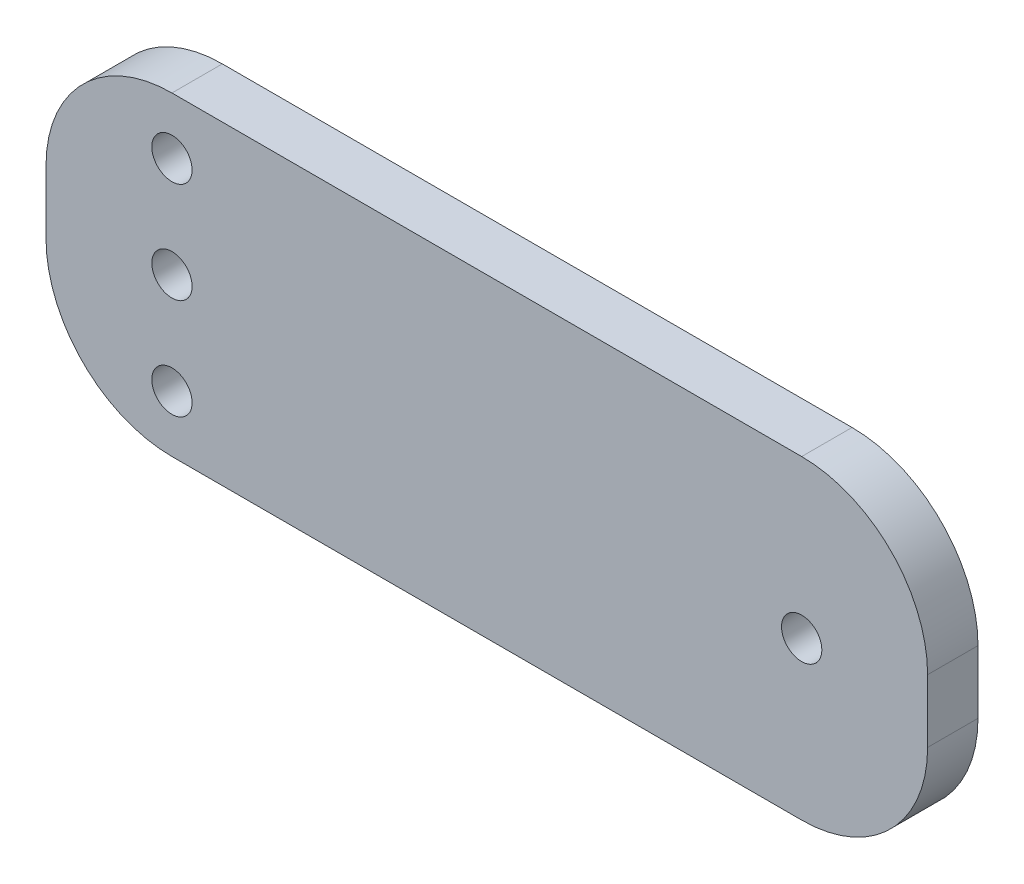
ISO-10303-21;
HEADER;
FILE_DESCRIPTION(('STEP AP214'),'2;1');
FILE_NAME('part.step','',(''),(''),'','','');
FILE_SCHEMA(('AUTOMOTIVE_DESIGN { 1 0 10303 214 1 1 1 1 }'));
ENDSEC;
DATA;
#1=APPLICATION_CONTEXT('core data for automotive mechanical design processes');
#2=APPLICATION_PROTOCOL_DEFINITION('international standard','automotive_design',2000,#1);
#3=PRODUCT_CONTEXT('',#1,'mechanical');
#4=PRODUCT('Part','Part','',(#3));
#5=PRODUCT_RELATED_PRODUCT_CATEGORY('part','',(#4));
#6=PRODUCT_DEFINITION_FORMATION('','',#4);
#7=PRODUCT_DEFINITION_CONTEXT('part definition',#1,'design');
#8=PRODUCT_DEFINITION('design','',#6,#7);
#9=PRODUCT_DEFINITION_SHAPE('','',#8);
#10=(LENGTH_UNIT() NAMED_UNIT(*) SI_UNIT(.MILLI.,.METRE.));
#11=(NAMED_UNIT(*) PLANE_ANGLE_UNIT() SI_UNIT($,.RADIAN.));
#12=(NAMED_UNIT(*) SI_UNIT($,.STERADIAN.) SOLID_ANGLE_UNIT());
#13=UNCERTAINTY_MEASURE_WITH_UNIT(LENGTH_MEASURE(1.E-05),#10,'distance_accuracy_value','');
#14=(GEOMETRIC_REPRESENTATION_CONTEXT(3) GLOBAL_UNCERTAINTY_ASSIGNED_CONTEXT((#13)) GLOBAL_UNIT_ASSIGNED_CONTEXT((#10,
#11,#12)) REPRESENTATION_CONTEXT('',''));
#15=CARTESIAN_POINT('',(0.,0.,0.));
#16=DIRECTION('',(0.,0.,1.));
#17=DIRECTION('',(1.,0.,0.));
#18=AXIS2_PLACEMENT_3D('',#15,#16,#17);
#19=CARTESIAN_POINT('',(0.,0.,4.));
#20=DIRECTION('',(0.,0.,-1.));
#21=DIRECTION('',(-1.,0.,0.));
#22=AXIS2_PLACEMENT_3D('',#19,#20,#21);
#23=PLANE('',#22);
#24=CARTESIAN_POINT('',(-25.,8.,4.));
#25=DIRECTION('',(0.,0.,1.));
#26=DIRECTION('',(1.,0.,0.));
#27=AXIS2_PLACEMENT_3D('',#24,#25,#26);
#28=CIRCLE('',#27,1.6);
#29=CARTESIAN_POINT('',(-23.4,8.,4.));
#30=VERTEX_POINT('',#29);
#31=EDGE_CURVE('E189',#30,#30,#28,.T.);
#32=ORIENTED_EDGE('',*,*,#31,.F.);
#33=EDGE_LOOP('',(#32));
#34=FACE_BOUND('',#33,.T.);
#35=CARTESIAN_POINT('',(-25.,0.,4.));
#36=DIRECTION('',(0.,0.,1.));
#37=DIRECTION('',(1.,0.,0.));
#38=AXIS2_PLACEMENT_3D('',#35,#36,#37);
#39=CIRCLE('',#38,1.6);
#40=CARTESIAN_POINT('',(-23.4,0.,4.));
#41=VERTEX_POINT('',#40);
#42=EDGE_CURVE('E175',#41,#41,#39,.T.);
#43=ORIENTED_EDGE('',*,*,#42,.F.);
#44=EDGE_LOOP('',(#43));
#45=FACE_BOUND('',#44,.T.);
#46=DIRECTION('',(-1.,0.,0.));
#47=VECTOR('',#46,1.);
#48=CARTESIAN_POINT('',(-35.,12.5,4.));
#49=LINE('',#48,#47);
#50=CARTESIAN_POINT('',(25.,12.5,4.));
#51=VERTEX_POINT('',#50);
#52=CARTESIAN_POINT('',(-25.,12.5,4.));
#53=VERTEX_POINT('',#52);
#54=EDGE_CURVE('E170',#51,#53,#49,.T.);
#55=ORIENTED_EDGE('',*,*,#54,.T.);
#56=CARTESIAN_POINT('',(-25.,2.49999999999999,4.));
#57=DIRECTION('',(0.,0.,-1.));
#58=DIRECTION('',(-1.,0.,0.));
#59=AXIS2_PLACEMENT_3D('',#56,#57,#58);
#60=CIRCLE('',#59,10.);
#61=CARTESIAN_POINT('',(-35.,2.49999999999999,4.));
#62=VERTEX_POINT('',#61);
#63=EDGE_CURVE('E151',#53,#62,#60,.F.);
#64=ORIENTED_EDGE('',*,*,#63,.T.);
#65=DIRECTION('',(0.,-1.,0.));
#66=VECTOR('',#65,1.);
#67=CARTESIAN_POINT('',(-35.,-12.5,4.));
#68=LINE('',#67,#66);
#69=CARTESIAN_POINT('',(-35.,-2.49999999999998,4.));
#70=VERTEX_POINT('',#69);
#71=EDGE_CURVE('E121',#62,#70,#68,.T.);
#72=ORIENTED_EDGE('',*,*,#71,.T.);
#73=CARTESIAN_POINT('',(-25.,-2.49999999999999,4.));
#74=DIRECTION('',(0.,0.,-1.));
#75=DIRECTION('',(-1.,0.,0.));
#76=AXIS2_PLACEMENT_3D('',#73,#74,#75);
#77=CIRCLE('',#76,10.);
#78=CARTESIAN_POINT('',(-25.,-12.5,4.));
#79=VERTEX_POINT('',#78);
#80=EDGE_CURVE('E57',#70,#79,#77,.F.);
#81=ORIENTED_EDGE('',*,*,#80,.T.);
#82=DIRECTION('',(1.,0.,0.));
#83=VECTOR('',#82,1.);
#84=CARTESIAN_POINT('',(-35.,-12.5,4.));
#85=LINE('',#84,#83);
#86=CARTESIAN_POINT('',(25.,-12.5,4.));
#87=VERTEX_POINT('',#86);
#88=EDGE_CURVE('E137',#79,#87,#85,.T.);
#89=ORIENTED_EDGE('',*,*,#88,.T.);
#90=CARTESIAN_POINT('',(25.,-2.5,4.));
#91=DIRECTION('',(0.,0.,-1.));
#92=DIRECTION('',(-1.,0.,0.));
#93=AXIS2_PLACEMENT_3D('',#90,#91,#92);
#94=CIRCLE('',#93,10.);
#95=CARTESIAN_POINT('',(35.,-2.5,4.));
#96=VERTEX_POINT('',#95);
#97=EDGE_CURVE('E148',#87,#96,#94,.F.);
#98=ORIENTED_EDGE('',*,*,#97,.T.);
#99=DIRECTION('',(0.,1.,0.));
#100=VECTOR('',#99,1.);
#101=CARTESIAN_POINT('',(35.,-12.5,4.));
#102=LINE('',#101,#100);
#103=CARTESIAN_POINT('',(35.,2.5,4.));
#104=VERTEX_POINT('',#103);
#105=EDGE_CURVE('E131',#96,#104,#102,.T.);
#106=ORIENTED_EDGE('',*,*,#105,.T.);
#107=CARTESIAN_POINT('',(25.,2.5,4.));
#108=DIRECTION('',(0.,0.,-1.));
#109=DIRECTION('',(-1.,0.,0.));
#110=AXIS2_PLACEMENT_3D('',#107,#108,#109);
#111=CIRCLE('',#110,10.);
#112=EDGE_CURVE('E146',#104,#51,#111,.F.);
#113=ORIENTED_EDGE('',*,*,#112,.T.);
#114=EDGE_LOOP('',(#55,#64,#72,#81,#89,#98,#106,#113));
#115=FACE_BOUND('',#114,.T.);
#116=CARTESIAN_POINT('',(25.,0.,4.));
#117=DIRECTION('',(0.,0.,1.));
#118=DIRECTION('',(1.,0.,0.));
#119=AXIS2_PLACEMENT_3D('',#116,#117,#118);
#120=CIRCLE('',#119,1.6);
#121=CARTESIAN_POINT('',(26.6,0.,4.));
#122=VERTEX_POINT('',#121);
#123=EDGE_CURVE('E184',#122,#122,#120,.T.);
#124=ORIENTED_EDGE('',*,*,#123,.F.);
#125=EDGE_LOOP('',(#124));
#126=FACE_BOUND('',#125,.T.);
#127=CARTESIAN_POINT('',(-25.,-8.,4.));
#128=DIRECTION('',(0.,0.,1.));
#129=DIRECTION('',(1.,0.,0.));
#130=AXIS2_PLACEMENT_3D('',#127,#128,#129);
#131=CIRCLE('',#130,1.6);
#132=CARTESIAN_POINT('',(-23.4,-8.,4.));
#133=VERTEX_POINT('',#132);
#134=EDGE_CURVE('E195',#133,#133,#131,.T.);
#135=ORIENTED_EDGE('',*,*,#134,.F.);
#136=EDGE_LOOP('',(#135));
#137=FACE_BOUND('',#136,.T.);
#138=ADVANCED_FACE('F35',(#34,#45,#115,#126,#137),#23,.F.);
#139=CARTESIAN_POINT('',(0.,0.,0.));
#140=DIRECTION('',(0.,0.,-1.));
#141=DIRECTION('',(-1.,0.,0.));
#142=AXIS2_PLACEMENT_3D('',#139,#140,#141);
#143=PLANE('',#142);
#144=CARTESIAN_POINT('',(-25.,8.,0.));
#145=DIRECTION('',(0.,0.,1.));
#146=DIRECTION('',(1.,0.,0.));
#147=AXIS2_PLACEMENT_3D('',#144,#145,#146);
#148=CIRCLE('',#147,1.6);
#149=CARTESIAN_POINT('',(-23.4,8.,0.));
#150=VERTEX_POINT('',#149);
#151=EDGE_CURVE('E192',#150,#150,#148,.T.);
#152=ORIENTED_EDGE('',*,*,#151,.T.);
#153=EDGE_LOOP('',(#152));
#154=FACE_BOUND('',#153,.T.);
#155=CARTESIAN_POINT('',(-25.,0.,0.));
#156=DIRECTION('',(0.,0.,1.));
#157=DIRECTION('',(1.,0.,0.));
#158=AXIS2_PLACEMENT_3D('',#155,#156,#157);
#159=CIRCLE('',#158,1.6);
#160=CARTESIAN_POINT('',(-23.4,0.,0.));
#161=VERTEX_POINT('',#160);
#162=EDGE_CURVE('E177',#161,#161,#159,.T.);
#163=ORIENTED_EDGE('',*,*,#162,.T.);
#164=EDGE_LOOP('',(#163));
#165=FACE_BOUND('',#164,.T.);
#166=DIRECTION('',(0.,-1.,0.));
#167=VECTOR('',#166,1.);
#168=CARTESIAN_POINT('',(-35.,-12.5,0.));
#169=LINE('',#168,#167);
#170=CARTESIAN_POINT('',(-35.,2.49999999999999,0.));
#171=VERTEX_POINT('',#170);
#172=CARTESIAN_POINT('',(-35.,-2.49999999999998,0.));
#173=VERTEX_POINT('',#172);
#174=EDGE_CURVE('E119',#171,#173,#169,.T.);
#175=ORIENTED_EDGE('',*,*,#174,.F.);
#176=CARTESIAN_POINT('',(-25.,2.49999999999999,0.));
#177=DIRECTION('',(0.,0.,-1.));
#178=DIRECTION('',(-1.,0.,0.));
#179=AXIS2_PLACEMENT_3D('',#176,#177,#178);
#180=CIRCLE('',#179,10.);
#181=CARTESIAN_POINT('',(-25.,12.5,0.));
#182=VERTEX_POINT('',#181);
#183=EDGE_CURVE('E102',#171,#182,#180,.T.);
#184=ORIENTED_EDGE('',*,*,#183,.T.);
#185=DIRECTION('',(-1.,0.,0.));
#186=VECTOR('',#185,1.);
#187=CARTESIAN_POINT('',(-35.,12.5,0.));
#188=LINE('',#187,#186);
#189=CARTESIAN_POINT('',(25.,12.5,0.));
#190=VERTEX_POINT('',#189);
#191=EDGE_CURVE('E129',#190,#182,#188,.T.);
#192=ORIENTED_EDGE('',*,*,#191,.F.);
#193=CARTESIAN_POINT('',(25.,2.5,0.));
#194=DIRECTION('',(0.,0.,-1.));
#195=DIRECTION('',(-1.,0.,0.));
#196=AXIS2_PLACEMENT_3D('',#193,#194,#195);
#197=CIRCLE('',#196,10.);
#198=CARTESIAN_POINT('',(35.,2.5,0.));
#199=VERTEX_POINT('',#198);
#200=EDGE_CURVE('E122',#190,#199,#197,.T.);
#201=ORIENTED_EDGE('',*,*,#200,.T.);
#202=DIRECTION('',(0.,1.,0.));
#203=VECTOR('',#202,1.);
#204=CARTESIAN_POINT('',(35.,-12.5,0.));
#205=LINE('',#204,#203);
#206=CARTESIAN_POINT('',(35.,-2.5,0.));
#207=VERTEX_POINT('',#206);
#208=EDGE_CURVE('E133',#207,#199,#205,.T.);
#209=ORIENTED_EDGE('',*,*,#208,.F.);
#210=CARTESIAN_POINT('',(25.,-2.5,0.));
#211=DIRECTION('',(0.,0.,-1.));
#212=DIRECTION('',(-1.,0.,0.));
#213=AXIS2_PLACEMENT_3D('',#210,#211,#212);
#214=CIRCLE('',#213,10.);
#215=CARTESIAN_POINT('',(25.,-12.5,0.));
#216=VERTEX_POINT('',#215);
#217=EDGE_CURVE('E140',#207,#216,#214,.T.);
#218=ORIENTED_EDGE('',*,*,#217,.T.);
#219=DIRECTION('',(1.,0.,0.));
#220=VECTOR('',#219,1.);
#221=CARTESIAN_POINT('',(-35.,-12.5,0.));
#222=LINE('',#221,#220);
#223=CARTESIAN_POINT('',(-25.,-12.5,0.));
#224=VERTEX_POINT('',#223);
#225=EDGE_CURVE('E128',#224,#216,#222,.T.);
#226=ORIENTED_EDGE('',*,*,#225,.F.);
#227=CARTESIAN_POINT('',(-25.,-2.49999999999999,0.));
#228=DIRECTION('',(0.,0.,-1.));
#229=DIRECTION('',(-1.,0.,0.));
#230=AXIS2_PLACEMENT_3D('',#227,#228,#229);
#231=CIRCLE('',#230,10.);
#232=EDGE_CURVE('E113',#224,#173,#231,.T.);
#233=ORIENTED_EDGE('',*,*,#232,.T.);
#234=EDGE_LOOP('',(#175,#184,#192,#201,#209,#218,#226,#233));
#235=FACE_BOUND('',#234,.T.);
#236=CARTESIAN_POINT('',(25.,0.,0.));
#237=DIRECTION('',(0.,0.,1.));
#238=DIRECTION('',(1.,0.,0.));
#239=AXIS2_PLACEMENT_3D('',#236,#237,#238);
#240=CIRCLE('',#239,1.6);
#241=CARTESIAN_POINT('',(26.6,0.,0.));
#242=VERTEX_POINT('',#241);
#243=EDGE_CURVE('E186',#242,#242,#240,.T.);
#244=ORIENTED_EDGE('',*,*,#243,.T.);
#245=EDGE_LOOP('',(#244));
#246=FACE_BOUND('',#245,.T.);
#247=CARTESIAN_POINT('',(-25.,-8.,0.));
#248=DIRECTION('',(0.,0.,1.));
#249=DIRECTION('',(1.,0.,0.));
#250=AXIS2_PLACEMENT_3D('',#247,#248,#249);
#251=CIRCLE('',#250,1.6);
#252=CARTESIAN_POINT('',(-23.4,-8.,0.));
#253=VERTEX_POINT('',#252);
#254=EDGE_CURVE('E198',#253,#253,#251,.T.);
#255=ORIENTED_EDGE('',*,*,#254,.T.);
#256=EDGE_LOOP('',(#255));
#257=FACE_BOUND('',#256,.T.);
#258=ADVANCED_FACE('F125',(#154,#165,#235,#246,#257),#143,.T.);
#259=CARTESIAN_POINT('',(35.,-12.5,4.));
#260=DIRECTION('',(-1.,0.,0.));
#261=DIRECTION('',(0.,0.,1.));
#262=AXIS2_PLACEMENT_3D('',#259,#260,#261);
#263=PLANE('',#262);
#264=ORIENTED_EDGE('',*,*,#105,.F.);
#265=DIRECTION('',(0.,0.,-1.));
#266=VECTOR('',#265,1.);
#267=CARTESIAN_POINT('',(35.,-2.5,4.));
#268=LINE('',#267,#266);
#269=EDGE_CURVE('E11',#96,#207,#268,.T.);
#270=ORIENTED_EDGE('',*,*,#269,.T.);
#271=ORIENTED_EDGE('',*,*,#208,.T.);
#272=DIRECTION('',(0.,0.,-1.));
#273=VECTOR('',#272,1.);
#274=CARTESIAN_POINT('',(35.,2.5,4.));
#275=LINE('',#274,#273);
#276=EDGE_CURVE('E43',#199,#104,#275,.F.);
#277=ORIENTED_EDGE('',*,*,#276,.T.);
#278=EDGE_LOOP('',(#264,#270,#271,#277));
#279=FACE_BOUND('',#278,.T.);
#280=ADVANCED_FACE('F161',(#279),#263,.F.);
#281=CARTESIAN_POINT('',(-35.,12.5,4.));
#282=DIRECTION('',(0.,-1.,0.));
#283=DIRECTION('',(1.,0.,0.));
#284=AXIS2_PLACEMENT_3D('',#281,#282,#283);
#285=PLANE('',#284);
#286=ORIENTED_EDGE('',*,*,#191,.T.);
#287=DIRECTION('',(0.,0.,-1.));
#288=VECTOR('',#287,1.);
#289=CARTESIAN_POINT('',(-25.,12.5,4.));
#290=LINE('',#289,#288);
#291=EDGE_CURVE('E107',#182,#53,#290,.F.);
#292=ORIENTED_EDGE('',*,*,#291,.T.);
#293=ORIENTED_EDGE('',*,*,#54,.F.);
#294=DIRECTION('',(0.,0.,-1.));
#295=VECTOR('',#294,1.);
#296=CARTESIAN_POINT('',(25.,12.5,4.));
#297=LINE('',#296,#295);
#298=EDGE_CURVE('E112',#51,#190,#297,.T.);
#299=ORIENTED_EDGE('',*,*,#298,.T.);
#300=EDGE_LOOP('',(#286,#292,#293,#299));
#301=FACE_BOUND('',#300,.T.);
#302=ADVANCED_FACE('F174',(#301),#285,.F.);
#303=CARTESIAN_POINT('',(-35.,-12.5,4.));
#304=DIRECTION('',(1.,0.,0.));
#305=DIRECTION('',(0.,0.,-1.));
#306=AXIS2_PLACEMENT_3D('',#303,#304,#305);
#307=PLANE('',#306);
#308=ORIENTED_EDGE('',*,*,#71,.F.);
#309=DIRECTION('',(0.,0.,-1.));
#310=VECTOR('',#309,1.);
#311=CARTESIAN_POINT('',(-35.,2.49999999999999,4.));
#312=LINE('',#311,#310);
#313=EDGE_CURVE('E106',#62,#171,#312,.T.);
#314=ORIENTED_EDGE('',*,*,#313,.T.);
#315=ORIENTED_EDGE('',*,*,#174,.T.);
#316=DIRECTION('',(0.,0.,-1.));
#317=VECTOR('',#316,1.);
#318=CARTESIAN_POINT('',(-35.,-2.49999999999998,4.));
#319=LINE('',#318,#317);
#320=EDGE_CURVE('E123',#173,#70,#319,.F.);
#321=ORIENTED_EDGE('',*,*,#320,.T.);
#322=EDGE_LOOP('',(#308,#314,#315,#321));
#323=FACE_BOUND('',#322,.T.);
#324=ADVANCED_FACE('F118',(#323),#307,.F.);
#325=CARTESIAN_POINT('',(-35.,-12.5,4.));
#326=DIRECTION('',(0.,1.,0.));
#327=DIRECTION('',(-1.,0.,0.));
#328=AXIS2_PLACEMENT_3D('',#325,#326,#327);
#329=PLANE('',#328);
#330=ORIENTED_EDGE('',*,*,#88,.F.);
#331=DIRECTION('',(0.,0.,-1.));
#332=VECTOR('',#331,1.);
#333=CARTESIAN_POINT('',(-25.,-12.5,4.));
#334=LINE('',#333,#332);
#335=EDGE_CURVE('E154',#79,#224,#334,.T.);
#336=ORIENTED_EDGE('',*,*,#335,.T.);
#337=ORIENTED_EDGE('',*,*,#225,.T.);
#338=DIRECTION('',(0.,0.,-1.));
#339=VECTOR('',#338,1.);
#340=CARTESIAN_POINT('',(25.,-12.5,4.));
#341=LINE('',#340,#339);
#342=EDGE_CURVE('E50',#216,#87,#341,.F.);
#343=ORIENTED_EDGE('',*,*,#342,.T.);
#344=EDGE_LOOP('',(#330,#336,#337,#343));
#345=FACE_BOUND('',#344,.T.);
#346=ADVANCED_FACE('F221',(#345),#329,.F.);
#347=CARTESIAN_POINT('',(-25.,0.,4.));
#348=DIRECTION('',(0.,0.,-1.));
#349=DIRECTION('',(-1.,0.,0.));
#350=AXIS2_PLACEMENT_3D('',#347,#348,#349);
#351=CYLINDRICAL_SURFACE('',#350,1.6);
#352=ORIENTED_EDGE('',*,*,#42,.T.);
#353=EDGE_LOOP('',(#352));
#354=FACE_BOUND('',#353,.T.);
#355=ORIENTED_EDGE('',*,*,#162,.F.);
#356=EDGE_LOOP('',(#355));
#357=FACE_BOUND('',#356,.T.);
#358=ADVANCED_FACE('F218',(#354,#357),#351,.F.);
#359=CARTESIAN_POINT('',(25.,0.,4.));
#360=DIRECTION('',(0.,0.,-1.));
#361=DIRECTION('',(-1.,0.,0.));
#362=AXIS2_PLACEMENT_3D('',#359,#360,#361);
#363=CYLINDRICAL_SURFACE('',#362,1.6);
#364=ORIENTED_EDGE('',*,*,#123,.T.);
#365=EDGE_LOOP('',(#364));
#366=FACE_BOUND('',#365,.T.);
#367=ORIENTED_EDGE('',*,*,#243,.F.);
#368=EDGE_LOOP('',(#367));
#369=FACE_BOUND('',#368,.T.);
#370=ADVANCED_FACE('F313',(#366,#369),#363,.F.);
#371=CARTESIAN_POINT('',(-25.,8.,4.));
#372=DIRECTION('',(0.,0.,-1.));
#373=DIRECTION('',(-1.,0.,0.));
#374=AXIS2_PLACEMENT_3D('',#371,#372,#373);
#375=CYLINDRICAL_SURFACE('',#374,1.6);
#376=ORIENTED_EDGE('',*,*,#31,.T.);
#377=EDGE_LOOP('',(#376));
#378=FACE_BOUND('',#377,.T.);
#379=ORIENTED_EDGE('',*,*,#151,.F.);
#380=EDGE_LOOP('',(#379));
#381=FACE_BOUND('',#380,.T.);
#382=ADVANCED_FACE('F304',(#378,#381),#375,.F.);
#383=CARTESIAN_POINT('',(-25.,-8.,4.));
#384=DIRECTION('',(0.,0.,-1.));
#385=DIRECTION('',(-1.,0.,0.));
#386=AXIS2_PLACEMENT_3D('',#383,#384,#385);
#387=CYLINDRICAL_SURFACE('',#386,1.6);
#388=ORIENTED_EDGE('',*,*,#134,.T.);
#389=EDGE_LOOP('',(#388));
#390=FACE_BOUND('',#389,.T.);
#391=ORIENTED_EDGE('',*,*,#254,.F.);
#392=EDGE_LOOP('',(#391));
#393=FACE_BOUND('',#392,.T.);
#394=ADVANCED_FACE('F204',(#390,#393),#387,.F.);
#395=CARTESIAN_POINT('',(-25.,2.49999999999999,4.));
#396=DIRECTION('',(0.,0.,-1.));
#397=DIRECTION('',(-1.,0.,0.));
#398=AXIS2_PLACEMENT_3D('',#395,#396,#397);
#399=CYLINDRICAL_SURFACE('',#398,10.);
#400=ORIENTED_EDGE('',*,*,#63,.F.);
#401=ORIENTED_EDGE('',*,*,#291,.F.);
#402=ORIENTED_EDGE('',*,*,#183,.F.);
#403=ORIENTED_EDGE('',*,*,#313,.F.);
#404=EDGE_LOOP('',(#400,#401,#402,#403));
#405=FACE_BOUND('',#404,.T.);
#406=ADVANCED_FACE('F105',(#405),#399,.T.);
#407=CARTESIAN_POINT('',(-25.,-2.49999999999999,4.));
#408=DIRECTION('',(0.,0.,-1.));
#409=DIRECTION('',(-1.,0.,0.));
#410=AXIS2_PLACEMENT_3D('',#407,#408,#409);
#411=CYLINDRICAL_SURFACE('',#410,10.);
#412=ORIENTED_EDGE('',*,*,#80,.F.);
#413=ORIENTED_EDGE('',*,*,#320,.F.);
#414=ORIENTED_EDGE('',*,*,#232,.F.);
#415=ORIENTED_EDGE('',*,*,#335,.F.);
#416=EDGE_LOOP('',(#412,#413,#414,#415));
#417=FACE_BOUND('',#416,.T.);
#418=ADVANCED_FACE('F232',(#417),#411,.T.);
#419=CARTESIAN_POINT('',(25.,-2.5,4.));
#420=DIRECTION('',(0.,0.,-1.));
#421=DIRECTION('',(-1.,0.,0.));
#422=AXIS2_PLACEMENT_3D('',#419,#420,#421);
#423=CYLINDRICAL_SURFACE('',#422,10.);
#424=ORIENTED_EDGE('',*,*,#97,.F.);
#425=ORIENTED_EDGE('',*,*,#342,.F.);
#426=ORIENTED_EDGE('',*,*,#217,.F.);
#427=ORIENTED_EDGE('',*,*,#269,.F.);
#428=EDGE_LOOP('',(#424,#425,#426,#427));
#429=FACE_BOUND('',#428,.T.);
#430=ADVANCED_FACE('F234',(#429),#423,.T.);
#431=CARTESIAN_POINT('',(25.,2.5,4.));
#432=DIRECTION('',(0.,0.,-1.));
#433=DIRECTION('',(-1.,0.,0.));
#434=AXIS2_PLACEMENT_3D('',#431,#432,#433);
#435=CYLINDRICAL_SURFACE('',#434,10.);
#436=ORIENTED_EDGE('',*,*,#112,.F.);
#437=ORIENTED_EDGE('',*,*,#276,.F.);
#438=ORIENTED_EDGE('',*,*,#200,.F.);
#439=ORIENTED_EDGE('',*,*,#298,.F.);
#440=EDGE_LOOP('',(#436,#437,#438,#439));
#441=FACE_BOUND('',#440,.T.);
#442=ADVANCED_FACE('F37',(#441),#435,.T.);
#443=CLOSED_SHELL('',(#138,#258,#280,#302,#324,#346,#358,#370,#382,#394,#406,#418,#430,#442));
#444=MANIFOLD_SOLID_BREP('B2',#443);
#445=ADVANCED_BREP_SHAPE_REPRESENTATION('',(#18,#444),#14);
#446=SHAPE_DEFINITION_REPRESENTATION(#9,#445);
ENDSEC;
END-ISO-10303-21;
